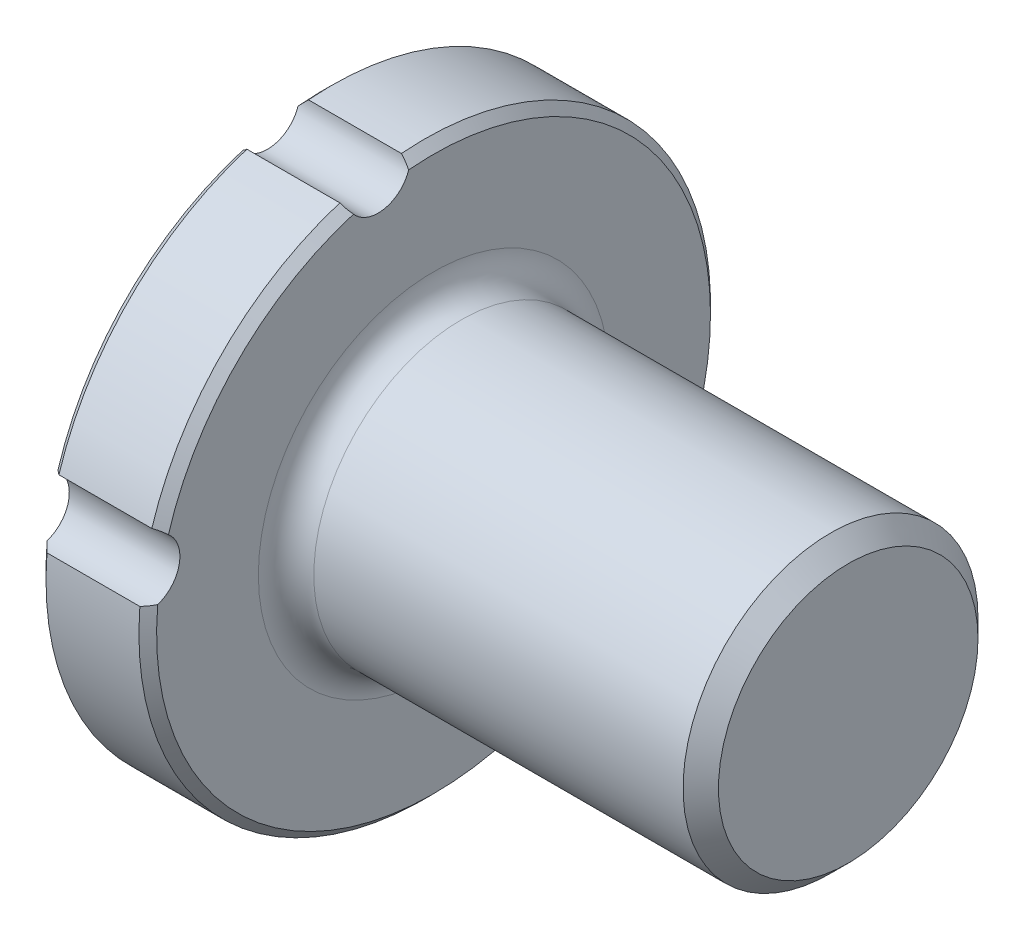
ISO-10303-21;
HEADER;
FILE_DESCRIPTION(('STEP AP214'),'2;1');
FILE_NAME('part.step','',(''),(''),'','','');
FILE_SCHEMA(('AUTOMOTIVE_DESIGN { 1 0 10303 214 1 1 1 1 }'));
ENDSEC;
DATA;
#1=APPLICATION_CONTEXT('core data for automotive mechanical design processes');
#2=APPLICATION_PROTOCOL_DEFINITION('international standard','automotive_design',2000,#1);
#3=PRODUCT_CONTEXT('',#1,'mechanical');
#4=PRODUCT('Part','Part','',(#3));
#5=PRODUCT_RELATED_PRODUCT_CATEGORY('part','',(#4));
#6=PRODUCT_DEFINITION_FORMATION('','',#4);
#7=PRODUCT_DEFINITION_CONTEXT('part definition',#1,'design');
#8=PRODUCT_DEFINITION('design','',#6,#7);
#9=PRODUCT_DEFINITION_SHAPE('','',#8);
#10=(LENGTH_UNIT() NAMED_UNIT(*) SI_UNIT(.MILLI.,.METRE.));
#11=(NAMED_UNIT(*) PLANE_ANGLE_UNIT() SI_UNIT($,.RADIAN.));
#12=(NAMED_UNIT(*) SI_UNIT($,.STERADIAN.) SOLID_ANGLE_UNIT());
#13=UNCERTAINTY_MEASURE_WITH_UNIT(LENGTH_MEASURE(1.E-05),#10,'distance_accuracy_value','');
#14=(GEOMETRIC_REPRESENTATION_CONTEXT(3) GLOBAL_UNCERTAINTY_ASSIGNED_CONTEXT((#13)) GLOBAL_UNIT_ASSIGNED_CONTEXT((#10,
#11,#12)) REPRESENTATION_CONTEXT('',''));
#15=CARTESIAN_POINT('',(0.,0.,0.));
#16=DIRECTION('',(0.,0.,1.));
#17=DIRECTION('',(1.,0.,0.));
#18=AXIS2_PLACEMENT_3D('',#15,#16,#17);
#19=CARTESIAN_POINT('',(9.525,0.,0.));
#20=DIRECTION('',(-1.,0.,0.));
#21=DIRECTION('',(0.,0.,1.));
#22=AXIS2_PLACEMENT_3D('',#19,#20,#21);
#23=CYLINDRICAL_SURFACE('',#22,24.6126);
#24=DIRECTION('',(-1.,0.,0.));
#25=VECTOR('',#24,1.);
#26=CARTESIAN_POINT('',(22.6187,2.00781555356097,24.5305677770181));
#27=LINE('',#26,#25);
#28=CARTESIAN_POINT('',(0.761999999999988,2.00781555356097,24.5305677770181));
#29=VERTEX_POINT('',#28);
#30=CARTESIAN_POINT('',(8.76299999999999,2.00781555356097,24.5305677770181));
#31=VERTEX_POINT('',#30);
#32=EDGE_CURVE('E140',#29,#31,#27,.F.);
#33=ORIENTED_EDGE('',*,*,#32,.F.);
#34=CARTESIAN_POINT('',(0.761999999999988,0.,0.));
#35=DIRECTION('',(1.,0.,0.));
#36=DIRECTION('',(0.,0.,-1.));
#37=AXIS2_PLACEMENT_3D('',#34,#35,#36);
#38=CIRCLE('',#37,24.6126);
#39=CARTESIAN_POINT('',(0.761999999999988,24.5305677770181,2.00781555356097));
#40=VERTEX_POINT('',#39);
#41=EDGE_CURVE('E259',#29,#40,#38,.T.);
#42=ORIENTED_EDGE('',*,*,#41,.T.);
#43=DIRECTION('',(-1.,0.,0.));
#44=VECTOR('',#43,1.);
#45=CARTESIAN_POINT('',(22.6187,24.5305677770181,2.00781555356097));
#46=LINE('',#45,#44);
#47=CARTESIAN_POINT('',(8.76299999999999,24.5305677770181,2.00781555356097));
#48=VERTEX_POINT('',#47);
#49=EDGE_CURVE('E137',#48,#40,#46,.T.);
#50=ORIENTED_EDGE('',*,*,#49,.F.);
#51=CARTESIAN_POINT('',(8.76299999999999,0.,0.));
#52=DIRECTION('',(1.,0.,0.));
#53=DIRECTION('',(0.,0.,-1.));
#54=AXIS2_PLACEMENT_3D('',#51,#52,#53);
#55=CIRCLE('',#54,24.6126);
#56=EDGE_CURVE('E113',#48,#31,#55,.F.);
#57=ORIENTED_EDGE('',*,*,#56,.T.);
#58=EDGE_LOOP('',(#33,#42,#50,#57));
#59=FACE_BOUND('',#58,.T.);
#60=ADVANCED_FACE('F41',(#59),#23,.T.);
#61=DIRECTION('',(-1.,0.,0.));
#62=VECTOR('',#61,1.);
#63=CARTESIAN_POINT('',(22.6187,7.31112836235858,23.5016484704609));
#64=LINE('',#63,#62);
#65=CARTESIAN_POINT('',(8.763,7.31112836235858,23.5016484704609));
#66=VERTEX_POINT('',#65);
#67=CARTESIAN_POINT('',(0.761999999999988,7.31112836235858,23.5016484704609));
#68=VERTEX_POINT('',#67);
#69=EDGE_CURVE('E135',#66,#68,#64,.T.);
#70=ORIENTED_EDGE('',*,*,#69,.F.);
#71=CARTESIAN_POINT('',(8.763,0.,0.));
#72=DIRECTION('',(1.,0.,0.));
#73=DIRECTION('',(0.,0.,-1.));
#74=AXIS2_PLACEMENT_3D('',#71,#72,#73);
#75=CIRCLE('',#74,24.6126);
#76=CARTESIAN_POINT('',(8.763,23.5016484704609,7.31112836235858));
#77=VERTEX_POINT('',#76);
#78=EDGE_CURVE('E116',#66,#77,#75,.F.);
#79=ORIENTED_EDGE('',*,*,#78,.T.);
#80=DIRECTION('',(-1.,0.,0.));
#81=VECTOR('',#80,1.);
#82=CARTESIAN_POINT('',(22.6187,23.5016484704609,7.31112836235858));
#83=LINE('',#82,#81);
#84=CARTESIAN_POINT('',(0.761999999999988,23.5016484704609,7.31112836235858));
#85=VERTEX_POINT('',#84);
#86=EDGE_CURVE('E134',#85,#77,#83,.F.);
#87=ORIENTED_EDGE('',*,*,#86,.F.);
#88=CARTESIAN_POINT('',(0.761999999999988,0.,0.));
#89=DIRECTION('',(1.,0.,0.));
#90=DIRECTION('',(0.,0.,-1.));
#91=AXIS2_PLACEMENT_3D('',#88,#89,#90);
#92=CIRCLE('',#91,24.6126);
#93=EDGE_CURVE('E244',#85,#68,#92,.T.);
#94=ORIENTED_EDGE('',*,*,#93,.T.);
#95=EDGE_LOOP('',(#70,#79,#87,#94));
#96=FACE_BOUND('',#95,.T.);
#97=ADVANCED_FACE('F251',(#96),#23,.T.);
#98=CARTESIAN_POINT('',(9.525,0.,0.));
#99=DIRECTION('',(1.,0.,0.));
#100=DIRECTION('',(0.,0.,-1.));
#101=AXIS2_PLACEMENT_3D('',#98,#99,#100);
#102=PLANE('',#101);
#103=CARTESIAN_POINT('',(9.525,0.,0.));
#104=DIRECTION('',(1.,0.,0.));
#105=DIRECTION('',(0.,0.,-1.));
#106=AXIS2_PLACEMENT_3D('',#103,#104,#105);
#107=CIRCLE('',#106,15.0876);
#108=CARTESIAN_POINT('',(9.525,0.,-15.0876));
#109=VERTEX_POINT('',#108);
#110=EDGE_CURVE('E128',#109,#109,#107,.F.);
#111=ORIENTED_EDGE('',*,*,#110,.T.);
#112=EDGE_LOOP('',(#111));
#113=FACE_BOUND('',#112,.T.);
#114=CARTESIAN_POINT('',(9.525,24.6126,4.7752));
#115=DIRECTION('',(1.,0.,0.));
#116=DIRECTION('',(0.,0.,-1.));
#117=AXIS2_PLACEMENT_3D('',#114,#115,#116);
#118=CIRCLE('',#117,2.7686);
#119=CARTESIAN_POINT('',(9.525,23.754124225441,2.14305917844518));
#120=VERTEX_POINT('',#119);
#121=CARTESIAN_POINT('',(9.525,22.8321123503746,6.89534378982451));
#122=VERTEX_POINT('',#121);
#123=EDGE_CURVE('E123',#120,#122,#118,.F.);
#124=ORIENTED_EDGE('',*,*,#123,.T.);
#125=CARTESIAN_POINT('',(9.525,0.,0.));
#126=DIRECTION('',(1.,0.,0.));
#127=DIRECTION('',(0.,0.,-1.));
#128=AXIS2_PLACEMENT_3D('',#125,#126,#127);
#129=CIRCLE('',#128,23.8506);
#130=CARTESIAN_POINT('',(9.525,6.89534378982451,22.8321123503746));
#131=VERTEX_POINT('',#130);
#132=EDGE_CURVE('E127',#122,#131,#129,.T.);
#133=ORIENTED_EDGE('',*,*,#132,.T.);
#134=CARTESIAN_POINT('',(9.525,4.7752,24.6126));
#135=DIRECTION('',(1.,0.,0.));
#136=DIRECTION('',(0.,0.,-1.));
#137=AXIS2_PLACEMENT_3D('',#134,#135,#136);
#138=CIRCLE('',#137,2.7686);
#139=CARTESIAN_POINT('',(9.525,2.14305917844518,23.754124225441));
#140=VERTEX_POINT('',#139);
#141=EDGE_CURVE('E126',#131,#140,#138,.F.);
#142=ORIENTED_EDGE('',*,*,#141,.T.);
#143=CARTESIAN_POINT('',(9.525,0.,0.));
#144=DIRECTION('',(1.,0.,0.));
#145=DIRECTION('',(0.,0.,-1.));
#146=AXIS2_PLACEMENT_3D('',#143,#144,#145);
#147=CIRCLE('',#146,23.8506);
#148=EDGE_CURVE('E112',#140,#120,#147,.T.);
#149=ORIENTED_EDGE('',*,*,#148,.T.);
#150=EDGE_LOOP('',(#124,#133,#142,#149));
#151=FACE_BOUND('',#150,.T.);
#152=ADVANCED_FACE('F121',(#113,#151),#102,.T.);
#153=CARTESIAN_POINT('',(0.,0.,0.));
#154=DIRECTION('',(1.,0.,0.));
#155=DIRECTION('',(0.,0.,-1.));
#156=AXIS2_PLACEMENT_3D('',#153,#154,#155);
#157=PLANE('',#156);
#158=CARTESIAN_POINT('',(0.,0.,0.));
#159=DIRECTION('',(1.,0.,0.));
#160=DIRECTION('',(0.,0.,-1.));
#161=AXIS2_PLACEMENT_3D('',#158,#159,#160);
#162=CIRCLE('',#161,9.0932);
#163=CARTESIAN_POINT('',(0.,0.,-9.0932));
#164=VERTEX_POINT('',#163);
#165=EDGE_CURVE('E151',#164,#164,#162,.T.);
#166=ORIENTED_EDGE('',*,*,#165,.T.);
#167=EDGE_LOOP('',(#166));
#168=FACE_BOUND('',#167,.T.);
#169=CARTESIAN_POINT('',(0.,4.7752,24.6126));
#170=DIRECTION('',(1.,0.,0.));
#171=DIRECTION('',(0.,0.,-1.));
#172=AXIS2_PLACEMENT_3D('',#169,#170,#171);
#173=CIRCLE('',#172,2.7686);
#174=CARTESIAN_POINT('',(0.,6.89534378982451,22.8321123503746));
#175=VERTEX_POINT('',#174);
#176=CARTESIAN_POINT('',(0.,2.14305917844518,23.754124225441));
#177=VERTEX_POINT('',#176);
#178=EDGE_CURVE('E148',#175,#177,#173,.F.);
#179=ORIENTED_EDGE('',*,*,#178,.F.);
#180=CARTESIAN_POINT('',(0.,0.,0.));
#181=DIRECTION('',(1.,0.,0.));
#182=DIRECTION('',(0.,0.,-1.));
#183=AXIS2_PLACEMENT_3D('',#180,#181,#182);
#184=CIRCLE('',#183,23.8506);
#185=CARTESIAN_POINT('',(0.,22.8321123503746,6.89534378982451));
#186=VERTEX_POINT('',#185);
#187=EDGE_CURVE('E64',#175,#186,#184,.F.);
#188=ORIENTED_EDGE('',*,*,#187,.T.);
#189=CARTESIAN_POINT('',(0.,24.6126,4.7752));
#190=DIRECTION('',(1.,0.,0.));
#191=DIRECTION('',(0.,0.,-1.));
#192=AXIS2_PLACEMENT_3D('',#189,#190,#191);
#193=CIRCLE('',#192,2.7686);
#194=CARTESIAN_POINT('',(0.,23.754124225441,2.14305917844518));
#195=VERTEX_POINT('',#194);
#196=EDGE_CURVE('E418',#186,#195,#193,.T.);
#197=ORIENTED_EDGE('',*,*,#196,.T.);
#198=CARTESIAN_POINT('',(0.,0.,0.));
#199=DIRECTION('',(1.,0.,0.));
#200=DIRECTION('',(0.,0.,-1.));
#201=AXIS2_PLACEMENT_3D('',#198,#199,#200);
#202=CIRCLE('',#201,23.8506);
#203=EDGE_CURVE('E254',#195,#177,#202,.F.);
#204=ORIENTED_EDGE('',*,*,#203,.T.);
#205=EDGE_LOOP('',(#179,#188,#197,#204));
#206=FACE_BOUND('',#205,.T.);
#207=ADVANCED_FACE('F282',(#168,#206),#157,.F.);
#208=CARTESIAN_POINT('',(45.2374,0.,0.));
#209=DIRECTION('',(-1.,0.,0.));
#210=DIRECTION('',(0.,0.,1.));
#211=AXIS2_PLACEMENT_3D('',#208,#209,#210);
#212=CYLINDRICAL_SURFACE('',#211,12.7);
#213=CARTESIAN_POINT('',(43.7134,0.,0.));
#214=DIRECTION('',(1.,0.,0.));
#215=DIRECTION('',(0.,0.,-1.));
#216=AXIS2_PLACEMENT_3D('',#213,#214,#215);
#217=CIRCLE('',#216,12.7);
#218=CARTESIAN_POINT('',(43.7134,0.,-12.7));
#219=VERTEX_POINT('',#218);
#220=EDGE_CURVE('E11',#219,#219,#217,.F.);
#221=ORIENTED_EDGE('',*,*,#220,.T.);
#222=EDGE_LOOP('',(#221));
#223=FACE_BOUND('',#222,.T.);
#224=CARTESIAN_POINT('',(11.9126,0.,0.));
#225=DIRECTION('',(1.,0.,0.));
#226=DIRECTION('',(0.,0.,-1.));
#227=AXIS2_PLACEMENT_3D('',#224,#225,#226);
#228=CIRCLE('',#227,12.7);
#229=CARTESIAN_POINT('',(11.9126,0.,-12.7));
#230=VERTEX_POINT('',#229);
#231=EDGE_CURVE('E157',#230,#230,#228,.T.);
#232=ORIENTED_EDGE('',*,*,#231,.T.);
#233=EDGE_LOOP('',(#232));
#234=FACE_BOUND('',#233,.T.);
#235=ADVANCED_FACE('F295',(#223,#234),#212,.T.);
#236=CARTESIAN_POINT('',(45.2374,0.,0.));
#237=DIRECTION('',(1.,0.,0.));
#238=DIRECTION('',(0.,0.,-1.));
#239=AXIS2_PLACEMENT_3D('',#236,#237,#238);
#240=PLANE('',#239);
#241=CARTESIAN_POINT('',(45.2374,0.,0.));
#242=DIRECTION('',(1.,0.,0.));
#243=DIRECTION('',(0.,0.,-1.));
#244=AXIS2_PLACEMENT_3D('',#241,#242,#243);
#245=CIRCLE('',#244,11.176);
#246=CARTESIAN_POINT('',(45.2374,0.,-11.176));
#247=VERTEX_POINT('',#246);
#248=EDGE_CURVE('E50',#247,#247,#245,.T.);
#249=ORIENTED_EDGE('',*,*,#248,.T.);
#250=EDGE_LOOP('',(#249));
#251=FACE_BOUND('',#250,.T.);
#252=ADVANCED_FACE('F264',(#251),#240,.T.);
#253=CARTESIAN_POINT('',(-4.826,0.,0.));
#254=DIRECTION('',(1.,0.,0.));
#255=DIRECTION('',(0.,0.,-1.));
#256=AXIS2_PLACEMENT_3D('',#253,#254,#255);
#257=CYLINDRICAL_SURFACE('',#256,8.7122);
#258=CARTESIAN_POINT('',(-0.381,0.,0.));
#259=DIRECTION('',(1.,0.,0.));
#260=DIRECTION('',(0.,0.,-1.));
#261=AXIS2_PLACEMENT_3D('',#258,#259,#260);
#262=CIRCLE('',#261,8.7122);
#263=CARTESIAN_POINT('',(-0.381,0.,-8.7122));
#264=VERTEX_POINT('',#263);
#265=EDGE_CURVE('E154',#264,#264,#262,.F.);
#266=ORIENTED_EDGE('',*,*,#265,.T.);
#267=EDGE_LOOP('',(#266));
#268=FACE_BOUND('',#267,.T.);
#269=CARTESIAN_POINT('',(-4.826,0.,0.));
#270=DIRECTION('',(1.,0.,0.));
#271=DIRECTION('',(0.,0.,-1.));
#272=AXIS2_PLACEMENT_3D('',#269,#270,#271);
#273=CIRCLE('',#272,8.7122);
#274=CARTESIAN_POINT('',(-4.826,0.,-8.7122));
#275=VERTEX_POINT('',#274);
#276=EDGE_CURVE('E145',#275,#275,#273,.T.);
#277=ORIENTED_EDGE('',*,*,#276,.T.);
#278=EDGE_LOOP('',(#277));
#279=FACE_BOUND('',#278,.T.);
#280=ADVANCED_FACE('F301',(#268,#279),#257,.T.);
#281=CARTESIAN_POINT('',(-4.826,0.,0.));
#282=DIRECTION('',(1.,0.,0.));
#283=DIRECTION('',(0.,0.,-1.));
#284=AXIS2_PLACEMENT_3D('',#281,#282,#283);
#285=PLANE('',#284);
#286=ORIENTED_EDGE('',*,*,#276,.F.);
#287=EDGE_LOOP('',(#286));
#288=FACE_BOUND('',#287,.T.);
#289=ADVANCED_FACE('F323',(#288),#285,.F.);
#290=CARTESIAN_POINT('',(45.2374,4.7752,24.6126));
#291=DIRECTION('',(-1.,0.,0.));
#292=DIRECTION('',(0.,0.,1.));
#293=AXIS2_PLACEMENT_3D('',#290,#291,#292);
#294=CYLINDRICAL_SURFACE('',#293,2.7686);
#295=ORIENTED_EDGE('',*,*,#141,.F.);
#296=CARTESIAN_POINT('',(9.525,6.89534378982451,22.8321123503746));
#297=CARTESIAN_POINT('',(9.46297794845104,6.9387378564909,22.8837940052714));
#298=CARTESIAN_POINT('',(9.40041644219547,6.97992370290609,22.9366635256084));
#299=CARTESIAN_POINT('',(9.27461222398438,7.05782326739409,23.0444185648814));
#300=CARTESIAN_POINT('',(9.21137183349064,7.09454886875381,23.0992981962391));
#301=CARTESIAN_POINT('',(9.08426949371173,7.16370685985997,23.2109955824729));
#302=CARTESIAN_POINT('',(9.02040756901321,7.19613941869549,23.2678132609046));
#303=CARTESIAN_POINT('',(8.8920726737373,7.25681222856466,23.3833682486288));
#304=CARTESIAN_POINT('',(8.82759851024879,7.28504078100853,23.4421103794298));
#305=CARTESIAN_POINT('',(8.76300000000001,7.31112836235858,23.5016484704609));
#306=B_SPLINE_CURVE_WITH_KNOTS('',3,(#296,#297,#298,#299,#300,#301,#302,#303,#304,#305),
.UNSPECIFIED.,.F.,.F.,(4,2,2,2,4),(0.,0.274915885862967,0.549082459742285,0.823238231869913,
1.0981431941986),.UNSPECIFIED.);
#307=EDGE_CURVE('E239',#131,#66,#306,.T.);
#308=ORIENTED_EDGE('',*,*,#307,.T.);
#309=ORIENTED_EDGE('',*,*,#69,.T.);
#310=CARTESIAN_POINT('',(0.761999999999988,7.31112836235858,23.5016484704609));
#311=CARTESIAN_POINT('',(0.697401489751206,7.28504078100852,23.4421103794298));
#312=CARTESIAN_POINT('',(0.632927326262691,7.25681222856465,23.3833682486288));
#313=CARTESIAN_POINT('',(0.504592430986785,7.19613941869549,23.2678132609046));
#314=CARTESIAN_POINT('',(0.440730506288264,7.16370685985997,23.2109955824729));
#315=CARTESIAN_POINT('',(0.313628166509356,7.09454886875382,23.0992981962391));
#316=CARTESIAN_POINT('',(0.250387776015619,7.05782326739409,23.0444185648814));
#317=CARTESIAN_POINT('',(0.124583557804534,6.97992370290609,22.9366635256084));
#318=CARTESIAN_POINT('',(0.0620220515489552,6.9387378564909,22.8837940052714));
#319=CARTESIAN_POINT('',(0.,6.89534378982451,22.8321123503746));
#320=B_SPLINE_CURVE_WITH_KNOTS('',3,(#310,#311,#312,#313,#314,#315,#316,#317,#318,#319),
.UNSPECIFIED.,.F.,.F.,(4,2,2,2,4),(0.,0.274904962328689,0.549060734456317,0.823227308335635,
1.0981431941986),.UNSPECIFIED.);
#321=EDGE_CURVE('E233',#68,#175,#320,.T.);
#322=ORIENTED_EDGE('',*,*,#321,.T.);
#323=ORIENTED_EDGE('',*,*,#178,.T.);
#324=CARTESIAN_POINT('',(0.,2.14305917844518,23.754124225441));
#325=CARTESIAN_POINT('',(0.062022051548955,2.12213994322914,23.8182835900941));
#326=CARTESIAN_POINT('',(0.124583557804534,2.10371292246819,23.8827188679431));
#327=CARTESIAN_POINT('',(0.250387776015621,2.07176043455623,24.0117867925115));
#328=CARTESIAN_POINT('',(0.313628166509359,2.05822174460137,24.0764184225969));
#329=CARTESIAN_POINT('',(0.440730506288267,2.03585086078223,24.2058737329648));
#330=CARTESIAN_POINT('',(0.50459243098679,2.02701848151007,24.2706974055804));
#331=CARTESIAN_POINT('',(0.632927326262695,2.01395972066192,24.400557383289));
#332=CARTESIAN_POINT('',(0.697401489751209,2.00974599193311,24.4655937853598));
#333=CARTESIAN_POINT('',(0.76199999999999,2.00781555356097,24.5305677770181));
#334=B_SPLINE_CURVE_WITH_KNOTS('',3,(#324,#325,#326,#327,#328,#329,#330,#331,#332,#333),
.UNSPECIFIED.,.F.,.F.,(4,2,2,2,4),(0.,0.274915885862965,0.549082459742287,0.823238231869918,
1.09814319419861),.UNSPECIFIED.);
#335=EDGE_CURVE('E170',#177,#29,#334,.T.);
#336=ORIENTED_EDGE('',*,*,#335,.T.);
#337=ORIENTED_EDGE('',*,*,#32,.T.);
#338=CARTESIAN_POINT('',(8.76299999999999,2.00781555356097,24.5305677770181));
#339=CARTESIAN_POINT('',(8.82759851024877,2.00974599193311,24.4655937853598));
#340=CARTESIAN_POINT('',(8.89207267373729,2.01395972066192,24.400557383289));
#341=CARTESIAN_POINT('',(9.0204075690132,2.02701848151007,24.2706974055804));
#342=CARTESIAN_POINT('',(9.08426949371172,2.03585086078223,24.2058737329648));
#343=CARTESIAN_POINT('',(9.21137183349063,2.05822174460137,24.0764184225969));
#344=CARTESIAN_POINT('',(9.27461222398437,2.07176043455623,24.0117867925115));
#345=CARTESIAN_POINT('',(9.40041644219546,2.10371292246819,23.8827188679431));
#346=CARTESIAN_POINT('',(9.46297794845104,2.12213994322914,23.8182835900941));
#347=CARTESIAN_POINT('',(9.525,2.14305917844518,23.754124225441));
#348=B_SPLINE_CURVE_WITH_KNOTS('',3,(#338,#339,#340,#341,#342,#343,#344,#345,#346,#347),
.UNSPECIFIED.,.F.,.F.,(4,2,2,2,4),(0.,0.274904962328694,0.549060734456326,0.823227308335651,
1.09814319419862),.UNSPECIFIED.);
#349=EDGE_CURVE('E163',#31,#140,#348,.T.);
#350=ORIENTED_EDGE('',*,*,#349,.T.);
#351=EDGE_LOOP('',(#295,#308,#309,#322,#323,#336,#337,#350));
#352=FACE_BOUND('',#351,.T.);
#353=ADVANCED_FACE('F177',(#352),#294,.F.);
#354=CARTESIAN_POINT('',(45.2374,24.6126,4.7752));
#355=DIRECTION('',(-1.,0.,0.));
#356=DIRECTION('',(0.,0.,1.));
#357=AXIS2_PLACEMENT_3D('',#354,#355,#356);
#358=CYLINDRICAL_SURFACE('',#357,2.7686);
#359=ORIENTED_EDGE('',*,*,#86,.T.);
#360=CARTESIAN_POINT('',(8.763,23.5016484704609,7.31112836235858));
#361=CARTESIAN_POINT('',(8.82759851024879,23.4421103794298,7.28504078100852));
#362=CARTESIAN_POINT('',(8.8920726737373,23.3833682486288,7.25681222856465));
#363=CARTESIAN_POINT('',(9.02040756901321,23.2678132609046,7.19613941869549));
#364=CARTESIAN_POINT('',(9.08426949371173,23.2109955824729,7.16370685985997));
#365=CARTESIAN_POINT('',(9.21137183349064,23.0992981962391,7.09454886875381));
#366=CARTESIAN_POINT('',(9.27461222398438,23.0444185648814,7.05782326739409));
#367=CARTESIAN_POINT('',(9.40041644219547,22.9366635256084,6.97992370290609));
#368=CARTESIAN_POINT('',(9.46297794845105,22.8837940052714,6.9387378564909));
#369=CARTESIAN_POINT('',(9.525,22.8321123503746,6.89534378982451));
#370=B_SPLINE_CURVE_WITH_KNOTS('',3,(#360,#361,#362,#363,#364,#365,#366,#367,#368,#369),
.UNSPECIFIED.,.F.,.F.,(4,2,2,2,4),(0.,0.274904962328691,0.549060734456321,0.82322730833564,
1.09814319419861),.UNSPECIFIED.);
#371=EDGE_CURVE('E133',#77,#122,#370,.T.);
#372=ORIENTED_EDGE('',*,*,#371,.T.);
#373=ORIENTED_EDGE('',*,*,#123,.F.);
#374=CARTESIAN_POINT('',(9.525,23.754124225441,2.14305917844518));
#375=CARTESIAN_POINT('',(9.46297794845104,23.8182835900941,2.12213994322914));
#376=CARTESIAN_POINT('',(9.40041644219546,23.8827188679431,2.10371292246819));
#377=CARTESIAN_POINT('',(9.27461222398437,24.0117867925115,2.07176043455623));
#378=CARTESIAN_POINT('',(9.21137183349063,24.0764184225969,2.05822174460137));
#379=CARTESIAN_POINT('',(9.08426949371172,24.2058737329648,2.03585086078223));
#380=CARTESIAN_POINT('',(9.0204075690132,24.2706974055804,2.02701848151007));
#381=CARTESIAN_POINT('',(8.89207267373729,24.400557383289,2.01395972066193));
#382=CARTESIAN_POINT('',(8.82759851024877,24.4655937853598,2.00974599193312));
#383=CARTESIAN_POINT('',(8.76299999999999,24.5305677770181,2.00781555356097));
#384=B_SPLINE_CURVE_WITH_KNOTS('',3,(#374,#375,#376,#377,#378,#379,#380,#381,#382,#383),
.UNSPECIFIED.,.F.,.F.,(4,2,2,2,4),(0.,0.274915885862968,0.549082459742291,0.823238231869925,
1.09814319419862),.UNSPECIFIED.);
#385=EDGE_CURVE('E108',#120,#48,#384,.T.);
#386=ORIENTED_EDGE('',*,*,#385,.T.);
#387=ORIENTED_EDGE('',*,*,#49,.T.);
#388=CARTESIAN_POINT('',(0.761999999999988,24.5305677770181,2.00781555356097));
#389=CARTESIAN_POINT('',(0.697401489751206,24.4655937853598,2.00974599193312));
#390=CARTESIAN_POINT('',(0.632927326262692,24.400557383289,2.01395972066193));
#391=CARTESIAN_POINT('',(0.504592430986786,24.2706974055804,2.02701848151007));
#392=CARTESIAN_POINT('',(0.440730506288265,24.2058737329648,2.03585086078223));
#393=CARTESIAN_POINT('',(0.313628166509359,24.0764184225969,2.05822174460137));
#394=CARTESIAN_POINT('',(0.250387776015621,24.0117867925115,2.07176043455623));
#395=CARTESIAN_POINT('',(0.124583557804535,23.8827188679431,2.10371292246819));
#396=CARTESIAN_POINT('',(0.0620220515489559,23.8182835900941,2.12213994322914));
#397=CARTESIAN_POINT('',(0.,23.754124225441,2.14305917844518));
#398=B_SPLINE_CURVE_WITH_KNOTS('',3,(#388,#389,#390,#391,#392,#393,#394,#395,#396,#397),
.UNSPECIFIED.,.F.,.F.,(4,2,2,2,4),(0.,0.27490496232869,0.549060734456316,0.823227308335634,
1.0981431941986),.UNSPECIFIED.);
#399=EDGE_CURVE('E57',#40,#195,#398,.T.);
#400=ORIENTED_EDGE('',*,*,#399,.T.);
#401=ORIENTED_EDGE('',*,*,#196,.F.);
#402=CARTESIAN_POINT('',(0.,22.8321123503746,6.89534378982451));
#403=CARTESIAN_POINT('',(0.0620220515489542,22.8837940052714,6.9387378564909));
#404=CARTESIAN_POINT('',(0.124583557804533,22.9366635256084,6.97992370290609));
#405=CARTESIAN_POINT('',(0.250387776015619,23.0444185648814,7.05782326739409));
#406=CARTESIAN_POINT('',(0.313628166509357,23.0992981962391,7.09454886875382));
#407=CARTESIAN_POINT('',(0.440730506288265,23.2109955824729,7.16370685985997));
#408=CARTESIAN_POINT('',(0.504592430986786,23.2678132609046,7.19613941869549));
#409=CARTESIAN_POINT('',(0.632927326262692,23.3833682486288,7.25681222856466));
#410=CARTESIAN_POINT('',(0.697401489751206,23.4421103794298,7.28504078100853));
#411=CARTESIAN_POINT('',(0.761999999999987,23.5016484704609,7.31112836235858));
#412=B_SPLINE_CURVE_WITH_KNOTS('',3,(#402,#403,#404,#405,#406,#407,#408,#409,#410,#411),
.UNSPECIFIED.,.F.,.F.,(4,2,2,2,4),(0.,0.274915885862965,0.549082459742283,0.823238231869911,
1.0981431941986),.UNSPECIFIED.);
#413=EDGE_CURVE('E210',#186,#85,#412,.T.);
#414=ORIENTED_EDGE('',*,*,#413,.T.);
#415=EDGE_LOOP('',(#359,#372,#373,#386,#387,#400,#401,#414));
#416=FACE_BOUND('',#415,.T.);
#417=ADVANCED_FACE('F131',(#416),#358,.F.);
#418=CARTESIAN_POINT('',(-0.381,0.,0.));
#419=DIRECTION('',(1.,0.,0.));
#420=DIRECTION('',(0.,0.,-1.));
#421=AXIS2_PLACEMENT_3D('',#418,#419,#420);
#422=TOROIDAL_SURFACE('',#421,9.0932,0.381);
#423=ORIENTED_EDGE('',*,*,#265,.F.);
#424=EDGE_LOOP('',(#423));
#425=FACE_BOUND('',#424,.T.);
#426=ORIENTED_EDGE('',*,*,#165,.F.);
#427=EDGE_LOOP('',(#426));
#428=FACE_BOUND('',#427,.T.);
#429=ADVANCED_FACE('F205',(#425,#428),#422,.F.);
#430=CARTESIAN_POINT('',(11.9126,0.,0.));
#431=DIRECTION('',(1.,0.,0.));
#432=DIRECTION('',(0.,0.,-1.));
#433=AXIS2_PLACEMENT_3D('',#430,#431,#432);
#434=TOROIDAL_SURFACE('',#433,15.0876,2.3876);
#435=ORIENTED_EDGE('',*,*,#110,.F.);
#436=EDGE_LOOP('',(#435));
#437=FACE_BOUND('',#436,.T.);
#438=ORIENTED_EDGE('',*,*,#231,.F.);
#439=EDGE_LOOP('',(#438));
#440=FACE_BOUND('',#439,.T.);
#441=ADVANCED_FACE('F285',(#437,#440),#434,.F.);
#442=CARTESIAN_POINT('',(9.525,0.,0.));
#443=DIRECTION('',(-1.,0.,0.));
#444=DIRECTION('',(0.,0.,1.));
#445=AXIS2_PLACEMENT_3D('',#442,#443,#444);
#446=CONICAL_SURFACE('',#445,23.8506,0.785398163397451);
#447=ORIENTED_EDGE('',*,*,#371,.F.);
#448=ORIENTED_EDGE('',*,*,#78,.F.);
#449=ORIENTED_EDGE('',*,*,#307,.F.);
#450=ORIENTED_EDGE('',*,*,#132,.F.);
#451=EDGE_LOOP('',(#447,#448,#449,#450));
#452=FACE_BOUND('',#451,.T.);
#453=ADVANCED_FACE('F228',(#452),#446,.T.);
#454=CARTESIAN_POINT('',(0.761999999999988,0.,0.));
#455=DIRECTION('',(1.,0.,0.));
#456=DIRECTION('',(0.,0.,-1.));
#457=AXIS2_PLACEMENT_3D('',#454,#455,#456);
#458=CONICAL_SURFACE('',#457,24.6126,0.785398163397455);
#459=ORIENTED_EDGE('',*,*,#413,.F.);
#460=ORIENTED_EDGE('',*,*,#187,.F.);
#461=ORIENTED_EDGE('',*,*,#321,.F.);
#462=ORIENTED_EDGE('',*,*,#93,.F.);
#463=EDGE_LOOP('',(#459,#460,#461,#462));
#464=FACE_BOUND('',#463,.T.);
#465=ADVANCED_FACE('F222',(#464),#458,.T.);
#466=CARTESIAN_POINT('',(0.761999999999988,0.,0.));
#467=DIRECTION('',(1.,0.,0.));
#468=DIRECTION('',(0.,0.,-1.));
#469=AXIS2_PLACEMENT_3D('',#466,#467,#468);
#470=CONICAL_SURFACE('',#469,24.6126,0.785398163397455);
#471=ORIENTED_EDGE('',*,*,#335,.F.);
#472=ORIENTED_EDGE('',*,*,#203,.F.);
#473=ORIENTED_EDGE('',*,*,#399,.F.);
#474=ORIENTED_EDGE('',*,*,#41,.F.);
#475=EDGE_LOOP('',(#471,#472,#473,#474));
#476=FACE_BOUND('',#475,.T.);
#477=ADVANCED_FACE('F187',(#476),#470,.T.);
#478=CARTESIAN_POINT('',(9.525,0.,0.));
#479=DIRECTION('',(-1.,0.,0.));
#480=DIRECTION('',(0.,0.,1.));
#481=AXIS2_PLACEMENT_3D('',#478,#479,#480);
#482=CONICAL_SURFACE('',#481,23.8506,0.785398163397444);
#483=ORIENTED_EDGE('',*,*,#349,.F.);
#484=ORIENTED_EDGE('',*,*,#56,.F.);
#485=ORIENTED_EDGE('',*,*,#385,.F.);
#486=ORIENTED_EDGE('',*,*,#148,.F.);
#487=EDGE_LOOP('',(#483,#484,#485,#486));
#488=FACE_BOUND('',#487,.T.);
#489=ADVANCED_FACE('F111',(#488),#482,.T.);
#490=CARTESIAN_POINT('',(45.2374,0.,0.));
#491=DIRECTION('',(-1.,0.,0.));
#492=DIRECTION('',(0.,0.,1.));
#493=AXIS2_PLACEMENT_3D('',#490,#491,#492);
#494=CONICAL_SURFACE('',#493,11.176,0.785398163397443);
#495=ORIENTED_EDGE('',*,*,#220,.F.);
#496=EDGE_LOOP('',(#495));
#497=FACE_BOUND('',#496,.T.);
#498=ORIENTED_EDGE('',*,*,#248,.F.);
#499=EDGE_LOOP('',(#498));
#500=FACE_BOUND('',#499,.T.);
#501=ADVANCED_FACE('F44',(#497,#500),#494,.T.);
#502=CLOSED_SHELL('',(#60,#97,#152,#207,#235,#252,#280,#289,#353,#417,#429,#441,#453,#465,#477,
#489,#501));
#503=MANIFOLD_SOLID_BREP('B2',#502);
#504=ADVANCED_BREP_SHAPE_REPRESENTATION('',(#18,#503),#14);
#505=SHAPE_DEFINITION_REPRESENTATION(#9,#504);
ENDSEC;
END-ISO-10303-21;
